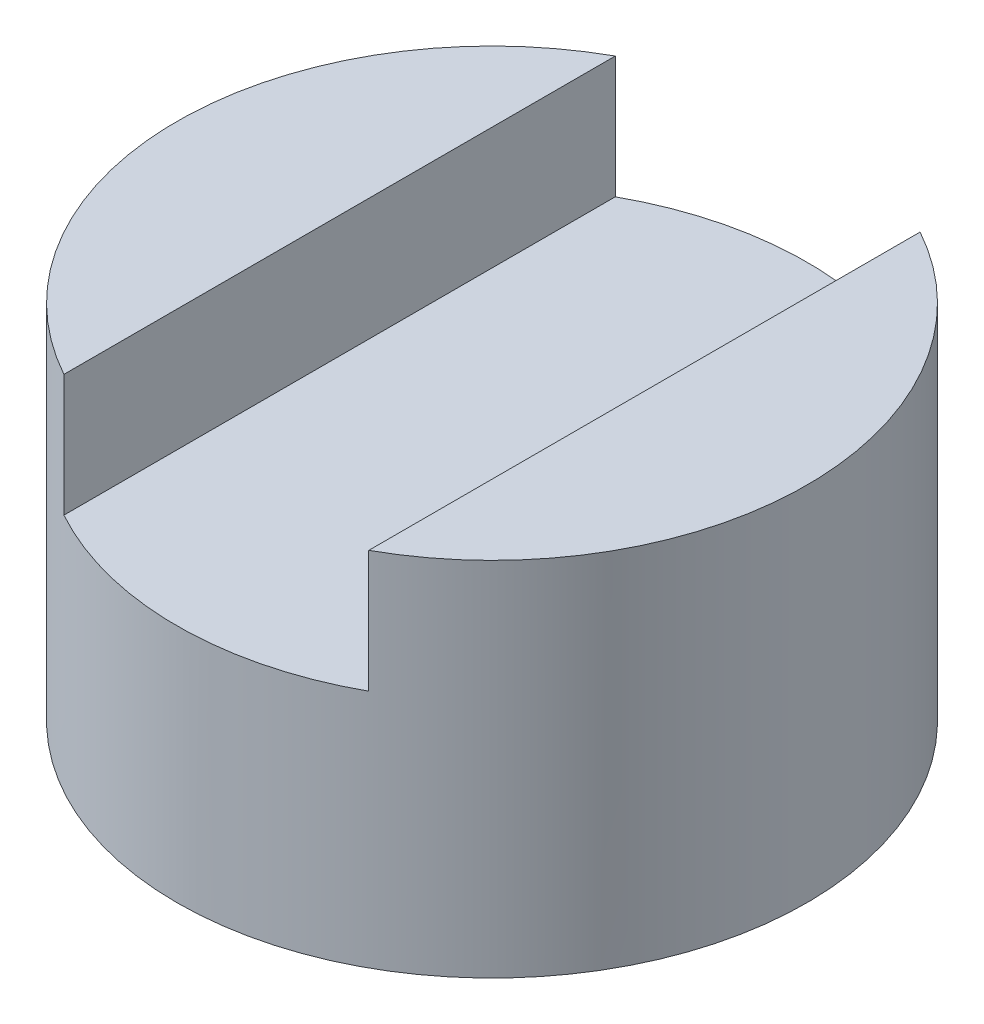
ISO-10303-21;
HEADER;
FILE_DESCRIPTION(('STEP AP214'),'2;1');
FILE_NAME('part.step','',(''),(''),'','','');
FILE_SCHEMA(('AUTOMOTIVE_DESIGN { 1 0 10303 214 1 1 1 1 }'));
ENDSEC;
DATA;
#1=APPLICATION_CONTEXT('core data for automotive mechanical design processes');
#2=APPLICATION_PROTOCOL_DEFINITION('international standard','automotive_design',2000,#1);
#3=PRODUCT_CONTEXT('',#1,'mechanical');
#4=PRODUCT('Part','Part','',(#3));
#5=PRODUCT_RELATED_PRODUCT_CATEGORY('part','',(#4));
#6=PRODUCT_DEFINITION_FORMATION('','',#4);
#7=PRODUCT_DEFINITION_CONTEXT('part definition',#1,'design');
#8=PRODUCT_DEFINITION('design','',#6,#7);
#9=PRODUCT_DEFINITION_SHAPE('','',#8);
#10=(LENGTH_UNIT() NAMED_UNIT(*) SI_UNIT(.MILLI.,.METRE.));
#11=(NAMED_UNIT(*) PLANE_ANGLE_UNIT() SI_UNIT($,.RADIAN.));
#12=(NAMED_UNIT(*) SI_UNIT($,.STERADIAN.) SOLID_ANGLE_UNIT());
#13=UNCERTAINTY_MEASURE_WITH_UNIT(LENGTH_MEASURE(1.E-05),#10,'distance_accuracy_value','');
#14=(GEOMETRIC_REPRESENTATION_CONTEXT(3) GLOBAL_UNCERTAINTY_ASSIGNED_CONTEXT((#13)) GLOBAL_UNIT_ASSIGNED_CONTEXT((#10,
#11,#12)) REPRESENTATION_CONTEXT('',''));
#15=CARTESIAN_POINT('',(0.,0.,0.));
#16=DIRECTION('',(0.,0.,1.));
#17=DIRECTION('',(1.,0.,0.));
#18=AXIS2_PLACEMENT_3D('',#15,#16,#17);
#19=CARTESIAN_POINT('',(0.,17.8,0.));
#20=DIRECTION('',(0.,1.,0.));
#21=DIRECTION('',(0.,0.,1.));
#22=AXIS2_PLACEMENT_3D('',#19,#20,#21);
#23=PLANE('',#22);
#24=DIRECTION('',(0.,0.,1.));
#25=VECTOR('',#24,1.);
#26=CARTESIAN_POINT('',(-7.5,17.8,-13.5646599662505));
#27=LINE('',#26,#25);
#28=CARTESIAN_POINT('',(-7.5,17.8,-13.5646599662505));
#29=VERTEX_POINT('',#28);
#30=CARTESIAN_POINT('',(-7.5,17.8,13.5646599662505));
#31=VERTEX_POINT('',#30);
#32=EDGE_CURVE('E74',#29,#31,#27,.T.);
#33=ORIENTED_EDGE('',*,*,#32,.F.);
#34=CARTESIAN_POINT('',(0.,17.8,0.));
#35=DIRECTION('',(0.,1.,0.));
#36=DIRECTION('',(0.,0.,1.));
#37=AXIS2_PLACEMENT_3D('',#34,#35,#36);
#38=CIRCLE('',#37,15.5);
#39=EDGE_CURVE('E44',#29,#31,#38,.T.);
#40=ORIENTED_EDGE('',*,*,#39,.T.);
#41=EDGE_LOOP('',(#33,#40));
#42=FACE_BOUND('',#41,.T.);
#43=ADVANCED_FACE('F35',(#42),#23,.T.);
#44=CARTESIAN_POINT('',(0.,17.8,0.));
#45=DIRECTION('',(0.,-1.,0.));
#46=DIRECTION('',(0.,0.,-1.));
#47=AXIS2_PLACEMENT_3D('',#44,#45,#46);
#48=CYLINDRICAL_SURFACE('',#47,15.5);
#49=ORIENTED_EDGE('',*,*,#39,.F.);
#50=DIRECTION('',(0.,1.,0.));
#51=VECTOR('',#50,1.);
#52=CARTESIAN_POINT('',(-7.5,11.8,-13.5646599662505));
#53=LINE('',#52,#51);
#54=CARTESIAN_POINT('',(-7.5,11.8,-13.5646599662505));
#55=VERTEX_POINT('',#54);
#56=EDGE_CURVE('E87',#55,#29,#53,.T.);
#57=ORIENTED_EDGE('',*,*,#56,.F.);
#58=CARTESIAN_POINT('',(0.,11.8,0.));
#59=DIRECTION('',(0.,1.,0.));
#60=DIRECTION('',(0.,0.,-1.));
#61=AXIS2_PLACEMENT_3D('',#58,#59,#60);
#62=CIRCLE('',#61,15.5);
#63=CARTESIAN_POINT('',(7.50000000000001,11.8,-13.5646599662505));
#64=VERTEX_POINT('',#63);
#65=EDGE_CURVE('E91',#64,#55,#62,.T.);
#66=ORIENTED_EDGE('',*,*,#65,.F.);
#67=DIRECTION('',(0.,1.,0.));
#68=VECTOR('',#67,1.);
#69=CARTESIAN_POINT('',(7.50000000000001,11.8,-13.5646599662505));
#70=LINE('',#69,#68);
#71=CARTESIAN_POINT('',(7.50000000000001,17.8,-13.5646599662505));
#72=VERTEX_POINT('',#71);
#73=EDGE_CURVE('E81',#64,#72,#70,.T.);
#74=ORIENTED_EDGE('',*,*,#73,.T.);
#75=CARTESIAN_POINT('',(7.50000000000001,17.8,13.5646599662505));
#76=VERTEX_POINT('',#75);
#77=EDGE_CURVE('E11',#76,#72,#38,.T.);
#78=ORIENTED_EDGE('',*,*,#77,.F.);
#79=DIRECTION('',(0.,1.,0.));
#80=VECTOR('',#79,1.);
#81=CARTESIAN_POINT('',(7.50000000000001,11.8,13.5646599662505));
#82=LINE('',#81,#80);
#83=CARTESIAN_POINT('',(7.50000000000001,11.8,13.5646599662505));
#84=VERTEX_POINT('',#83);
#85=EDGE_CURVE('E51',#84,#76,#82,.T.);
#86=ORIENTED_EDGE('',*,*,#85,.F.);
#87=CARTESIAN_POINT('',(0.,11.8,0.));
#88=DIRECTION('',(0.,1.,0.));
#89=DIRECTION('',(0.,0.,1.));
#90=AXIS2_PLACEMENT_3D('',#87,#88,#89);
#91=CIRCLE('',#90,15.5);
#92=CARTESIAN_POINT('',(-7.5,11.8,13.5646599662505));
#93=VERTEX_POINT('',#92);
#94=EDGE_CURVE('E93',#93,#84,#91,.T.);
#95=ORIENTED_EDGE('',*,*,#94,.F.);
#96=DIRECTION('',(0.,1.,0.));
#97=VECTOR('',#96,1.);
#98=CARTESIAN_POINT('',(-7.5,11.8,13.5646599662505));
#99=LINE('',#98,#97);
#100=EDGE_CURVE('E60',#93,#31,#99,.T.);
#101=ORIENTED_EDGE('',*,*,#100,.T.);
#102=EDGE_LOOP('',(#49,#57,#66,#74,#78,#86,#95,#101));
#103=FACE_BOUND('',#102,.T.);
#104=CARTESIAN_POINT('',(0.,0.,0.));
#105=DIRECTION('',(0.,1.,0.));
#106=DIRECTION('',(0.,0.,1.));
#107=AXIS2_PLACEMENT_3D('',#104,#105,#106);
#108=CIRCLE('',#107,15.5);
#109=CARTESIAN_POINT('',(0.,0.,15.5));
#110=VERTEX_POINT('',#109);
#111=EDGE_CURVE('E39',#110,#110,#108,.T.);
#112=ORIENTED_EDGE('',*,*,#111,.T.);
#113=EDGE_LOOP('',(#112));
#114=FACE_BOUND('',#113,.T.);
#115=ADVANCED_FACE('F37',(#103,#114),#48,.T.);
#116=DIRECTION('',(0.,0.,-1.));
#117=VECTOR('',#116,1.);
#118=CARTESIAN_POINT('',(7.50000000000001,17.8,-13.5646599662505));
#119=LINE('',#118,#117);
#120=EDGE_CURVE('E83',#76,#72,#119,.T.);
#121=ORIENTED_EDGE('',*,*,#120,.F.);
#122=ORIENTED_EDGE('',*,*,#77,.T.);
#123=EDGE_LOOP('',(#121,#122));
#124=FACE_BOUND('',#123,.T.);
#125=ADVANCED_FACE('F115',(#124),#23,.T.);
#126=CARTESIAN_POINT('',(0.,0.,0.));
#127=DIRECTION('',(0.,1.,0.));
#128=DIRECTION('',(0.,0.,1.));
#129=AXIS2_PLACEMENT_3D('',#126,#127,#128);
#130=PLANE('',#129);
#131=ORIENTED_EDGE('',*,*,#111,.F.);
#132=EDGE_LOOP('',(#131));
#133=FACE_BOUND('',#132,.T.);
#134=ADVANCED_FACE('F113',(#133),#130,.F.);
#135=CARTESIAN_POINT('',(-7.5,11.8,-13.5646599662505));
#136=DIRECTION('',(-1.,0.,0.));
#137=DIRECTION('',(0.,0.,1.));
#138=AXIS2_PLACEMENT_3D('',#135,#136,#137);
#139=PLANE('',#138);
#140=ORIENTED_EDGE('',*,*,#32,.T.);
#141=ORIENTED_EDGE('',*,*,#100,.F.);
#142=DIRECTION('',(0.,0.,1.));
#143=VECTOR('',#142,1.);
#144=CARTESIAN_POINT('',(-7.5,11.8,-13.5646599662505));
#145=LINE('',#144,#143);
#146=EDGE_CURVE('E98',#55,#93,#145,.T.);
#147=ORIENTED_EDGE('',*,*,#146,.F.);
#148=ORIENTED_EDGE('',*,*,#56,.T.);
#149=EDGE_LOOP('',(#140,#141,#147,#148));
#150=FACE_BOUND('',#149,.T.);
#151=ADVANCED_FACE('F107',(#150),#139,.F.);
#152=CARTESIAN_POINT('',(7.50000000000001,11.8,-13.5646599662505));
#153=DIRECTION('',(1.,0.,0.));
#154=DIRECTION('',(0.,0.,-1.));
#155=AXIS2_PLACEMENT_3D('',#152,#153,#154);
#156=PLANE('',#155);
#157=ORIENTED_EDGE('',*,*,#120,.T.);
#158=ORIENTED_EDGE('',*,*,#73,.F.);
#159=DIRECTION('',(0.,0.,-1.));
#160=VECTOR('',#159,1.);
#161=CARTESIAN_POINT('',(7.50000000000001,11.8,-13.5646599662505));
#162=LINE('',#161,#160);
#163=EDGE_CURVE('E78',#84,#64,#162,.T.);
#164=ORIENTED_EDGE('',*,*,#163,.F.);
#165=ORIENTED_EDGE('',*,*,#85,.T.);
#166=EDGE_LOOP('',(#157,#158,#164,#165));
#167=FACE_BOUND('',#166,.T.);
#168=ADVANCED_FACE('F82',(#167),#156,.F.);
#169=CARTESIAN_POINT('',(0.,11.8,0.));
#170=DIRECTION('',(0.,1.,0.));
#171=DIRECTION('',(0.,0.,1.));
#172=AXIS2_PLACEMENT_3D('',#169,#170,#171);
#173=PLANE('',#172);
#174=ORIENTED_EDGE('',*,*,#94,.T.);
#175=ORIENTED_EDGE('',*,*,#163,.T.);
#176=ORIENTED_EDGE('',*,*,#65,.T.);
#177=ORIENTED_EDGE('',*,*,#146,.T.);
#178=EDGE_LOOP('',(#174,#175,#176,#177));
#179=FACE_BOUND('',#178,.T.);
#180=ADVANCED_FACE('F90',(#179),#173,.T.);
#181=CLOSED_SHELL('',(#43,#115,#125,#134,#151,#168,#180));
#182=MANIFOLD_SOLID_BREP('B2',#181);
#183=ADVANCED_BREP_SHAPE_REPRESENTATION('',(#18,#182),#14);
#184=SHAPE_DEFINITION_REPRESENTATION(#9,#183);
ENDSEC;
END-ISO-10303-21;
